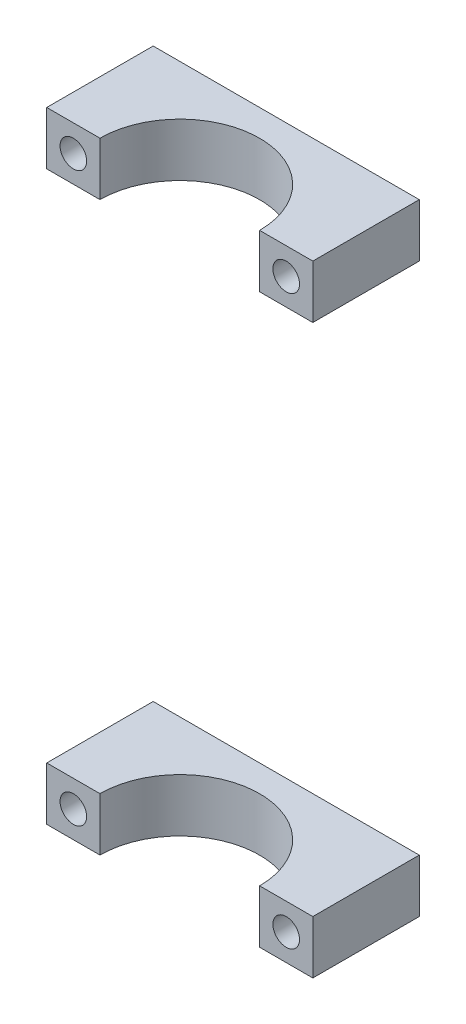
ISO-10303-21;
HEADER;
FILE_DESCRIPTION(('STEP AP214'),'2;1');
FILE_NAME('part.step','',(''),(''),'','','');
FILE_SCHEMA(('AUTOMOTIVE_DESIGN { 1 0 10303 214 1 1 1 1 }'));
ENDSEC;
DATA;
#1=APPLICATION_CONTEXT('core data for automotive mechanical design processes');
#2=APPLICATION_PROTOCOL_DEFINITION('international standard','automotive_design',2000,#1);
#3=PRODUCT_CONTEXT('',#1,'mechanical');
#4=PRODUCT('Part','Part','',(#3));
#5=PRODUCT_RELATED_PRODUCT_CATEGORY('part','',(#4));
#6=PRODUCT_DEFINITION_FORMATION('','',#4);
#7=PRODUCT_DEFINITION_CONTEXT('part definition',#1,'design');
#8=PRODUCT_DEFINITION('design','',#6,#7);
#9=PRODUCT_DEFINITION_SHAPE('','',#8);
#10=(LENGTH_UNIT() NAMED_UNIT(*) SI_UNIT(.MILLI.,.METRE.));
#11=(NAMED_UNIT(*) PLANE_ANGLE_UNIT() SI_UNIT($,.RADIAN.));
#12=(NAMED_UNIT(*) SI_UNIT($,.STERADIAN.) SOLID_ANGLE_UNIT());
#13=UNCERTAINTY_MEASURE_WITH_UNIT(LENGTH_MEASURE(1.E-05),#10,'distance_accuracy_value','');
#14=(GEOMETRIC_REPRESENTATION_CONTEXT(3) GLOBAL_UNCERTAINTY_ASSIGNED_CONTEXT((#13)) GLOBAL_UNIT_ASSIGNED_CONTEXT((#10,
#11,#12)) REPRESENTATION_CONTEXT('',''));
#15=CARTESIAN_POINT('',(0.,0.,0.));
#16=DIRECTION('',(0.,0.,1.));
#17=DIRECTION('',(1.,0.,0.));
#18=AXIS2_PLACEMENT_3D('',#15,#16,#17);
#19=CARTESIAN_POINT('',(40.,79.,-24.));
#20=DIRECTION('',(-1.,0.,0.));
#21=DIRECTION('',(0.,0.,1.));
#22=AXIS2_PLACEMENT_3D('',#19,#20,#21);
#23=PLANE('',#22);
#24=DIRECTION('',(0.,0.,1.));
#25=VECTOR('',#24,1.);
#26=CARTESIAN_POINT('',(40.,85.,-24.));
#27=LINE('',#26,#25);
#28=CARTESIAN_POINT('',(40.,85.,-24.));
#29=VERTEX_POINT('',#28);
#30=CARTESIAN_POINT('',(40.,85.,-12.));
#31=VERTEX_POINT('',#30);
#32=EDGE_CURVE('E125',#29,#31,#27,.T.);
#33=ORIENTED_EDGE('',*,*,#32,.T.);
#34=DIRECTION('',(0.,-1.,0.));
#35=VECTOR('',#34,1.);
#36=CARTESIAN_POINT('',(40.,79.,-12.));
#37=LINE('',#36,#35);
#38=CARTESIAN_POINT('',(40.,79.,-12.));
#39=VERTEX_POINT('',#38);
#40=EDGE_CURVE('E59',#31,#39,#37,.T.);
#41=ORIENTED_EDGE('',*,*,#40,.T.);
#42=DIRECTION('',(0.,0.,1.));
#43=VECTOR('',#42,1.);
#44=CARTESIAN_POINT('',(40.,79.,-24.));
#45=LINE('',#44,#43);
#46=CARTESIAN_POINT('',(40.,79.,-24.));
#47=VERTEX_POINT('',#46);
#48=EDGE_CURVE('E106',#47,#39,#45,.T.);
#49=ORIENTED_EDGE('',*,*,#48,.F.);
#50=DIRECTION('',(0.,-1.,0.));
#51=VECTOR('',#50,1.);
#52=CARTESIAN_POINT('',(40.,79.,-24.));
#53=LINE('',#52,#51);
#54=EDGE_CURVE('E112',#29,#47,#53,.T.);
#55=ORIENTED_EDGE('',*,*,#54,.F.);
#56=EDGE_LOOP('',(#33,#41,#49,#55));
#57=FACE_BOUND('',#56,.T.);
#58=ADVANCED_FACE('F42',(#57),#23,.F.);
#59=CARTESIAN_POINT('',(40.,79.,-24.));
#60=DIRECTION('',(0.,1.,0.));
#61=DIRECTION('',(-1.,0.,0.));
#62=AXIS2_PLACEMENT_3D('',#59,#60,#61);
#63=PLANE('',#62);
#64=ORIENTED_EDGE('',*,*,#48,.T.);
#65=DIRECTION('',(-1.,0.,0.));
#66=VECTOR('',#65,1.);
#67=CARTESIAN_POINT('',(40.,79.,-12.));
#68=LINE('',#67,#66);
#69=CARTESIAN_POINT('',(34.,79.,-12.));
#70=VERTEX_POINT('',#69);
#71=EDGE_CURVE('E120',#39,#70,#68,.T.);
#72=ORIENTED_EDGE('',*,*,#71,.T.);
#73=CARTESIAN_POINT('',(25.,79.,-12.));
#74=DIRECTION('',(0.,1.,0.));
#75=DIRECTION('',(-1.,0.,0.));
#76=AXIS2_PLACEMENT_3D('',#73,#74,#75);
#77=CIRCLE('',#76,9.);
#78=CARTESIAN_POINT('',(16.,79.,-12.));
#79=VERTEX_POINT('',#78);
#80=EDGE_CURVE('E122',#70,#79,#77,.T.);
#81=ORIENTED_EDGE('',*,*,#80,.T.);
#82=CARTESIAN_POINT('',(10.,79.,-12.));
#83=VERTEX_POINT('',#82);
#84=EDGE_CURVE('E124',#79,#83,#68,.T.);
#85=ORIENTED_EDGE('',*,*,#84,.T.);
#86=DIRECTION('',(0.,0.,1.));
#87=VECTOR('',#86,1.);
#88=CARTESIAN_POINT('',(10.,79.,-24.));
#89=LINE('',#88,#87);
#90=CARTESIAN_POINT('',(10.,79.,-24.));
#91=VERTEX_POINT('',#90);
#92=EDGE_CURVE('E109',#91,#83,#89,.T.);
#93=ORIENTED_EDGE('',*,*,#92,.F.);
#94=DIRECTION('',(-1.,0.,0.));
#95=VECTOR('',#94,1.);
#96=CARTESIAN_POINT('',(40.,79.,-24.));
#97=LINE('',#96,#95);
#98=EDGE_CURVE('E102',#47,#91,#97,.T.);
#99=ORIENTED_EDGE('',*,*,#98,.F.);
#100=EDGE_LOOP('',(#64,#72,#81,#85,#93,#99));
#101=FACE_BOUND('',#100,.T.);
#102=ADVANCED_FACE('F103',(#101),#63,.F.);
#103=CARTESIAN_POINT('',(10.,79.,-24.));
#104=DIRECTION('',(1.,0.,0.));
#105=DIRECTION('',(0.,0.,-1.));
#106=AXIS2_PLACEMENT_3D('',#103,#104,#105);
#107=PLANE('',#106);
#108=ORIENTED_EDGE('',*,*,#92,.T.);
#109=DIRECTION('',(0.,1.,0.));
#110=VECTOR('',#109,1.);
#111=CARTESIAN_POINT('',(10.,79.,-12.));
#112=LINE('',#111,#110);
#113=CARTESIAN_POINT('',(10.,85.,-12.));
#114=VERTEX_POINT('',#113);
#115=EDGE_CURVE('E132',#83,#114,#112,.T.);
#116=ORIENTED_EDGE('',*,*,#115,.T.);
#117=DIRECTION('',(0.,0.,1.));
#118=VECTOR('',#117,1.);
#119=CARTESIAN_POINT('',(10.,85.,-24.));
#120=LINE('',#119,#118);
#121=CARTESIAN_POINT('',(10.,85.,-24.));
#122=VERTEX_POINT('',#121);
#123=EDGE_CURVE('E133',#122,#114,#120,.T.);
#124=ORIENTED_EDGE('',*,*,#123,.F.);
#125=DIRECTION('',(0.,1.,0.));
#126=VECTOR('',#125,1.);
#127=CARTESIAN_POINT('',(10.,79.,-24.));
#128=LINE('',#127,#126);
#129=EDGE_CURVE('E111',#91,#122,#128,.T.);
#130=ORIENTED_EDGE('',*,*,#129,.F.);
#131=EDGE_LOOP('',(#108,#116,#124,#130));
#132=FACE_BOUND('',#131,.T.);
#133=ADVANCED_FACE('F165',(#132),#107,.F.);
#134=CARTESIAN_POINT('',(40.,85.,-24.));
#135=DIRECTION('',(0.,-1.,0.));
#136=DIRECTION('',(1.,0.,0.));
#137=AXIS2_PLACEMENT_3D('',#134,#135,#136);
#138=PLANE('',#137);
#139=ORIENTED_EDGE('',*,*,#123,.T.);
#140=DIRECTION('',(1.,0.,0.));
#141=VECTOR('',#140,1.);
#142=CARTESIAN_POINT('',(40.,85.,-12.));
#143=LINE('',#142,#141);
#144=CARTESIAN_POINT('',(16.,85.,-12.));
#145=VERTEX_POINT('',#144);
#146=EDGE_CURVE('E76',#114,#145,#143,.T.);
#147=ORIENTED_EDGE('',*,*,#146,.T.);
#148=CARTESIAN_POINT('',(25.,85.,-12.));
#149=DIRECTION('',(0.,-1.,0.));
#150=DIRECTION('',(1.,0.,0.));
#151=AXIS2_PLACEMENT_3D('',#148,#149,#150);
#152=CIRCLE('',#151,9.);
#153=CARTESIAN_POINT('',(34.,85.,-12.));
#154=VERTEX_POINT('',#153);
#155=EDGE_CURVE('E129',#145,#154,#152,.T.);
#156=ORIENTED_EDGE('',*,*,#155,.T.);
#157=EDGE_CURVE('E146',#154,#31,#143,.T.);
#158=ORIENTED_EDGE('',*,*,#157,.T.);
#159=ORIENTED_EDGE('',*,*,#32,.F.);
#160=DIRECTION('',(1.,0.,0.));
#161=VECTOR('',#160,1.);
#162=CARTESIAN_POINT('',(40.,85.,-24.));
#163=LINE('',#162,#161);
#164=EDGE_CURVE('E89',#122,#29,#163,.T.);
#165=ORIENTED_EDGE('',*,*,#164,.F.);
#166=EDGE_LOOP('',(#139,#147,#156,#158,#159,#165));
#167=FACE_BOUND('',#166,.T.);
#168=ADVANCED_FACE('F162',(#167),#138,.F.);
#169=CARTESIAN_POINT('',(0.,0.,-24.));
#170=DIRECTION('',(0.,0.,1.));
#171=DIRECTION('',(1.,0.,0.));
#172=AXIS2_PLACEMENT_3D('',#169,#170,#171);
#173=PLANE('',#172);
#174=CARTESIAN_POINT('',(13.,82.,-24.));
#175=DIRECTION('',(0.,0.,1.));
#176=DIRECTION('',(1.,0.,0.));
#177=AXIS2_PLACEMENT_3D('',#174,#175,#176);
#178=CIRCLE('',#177,1.5);
#179=CARTESIAN_POINT('',(14.5,82.,-24.));
#180=VERTEX_POINT('',#179);
#181=EDGE_CURVE('E157',#180,#180,#178,.T.);
#182=ORIENTED_EDGE('',*,*,#181,.T.);
#183=EDGE_LOOP('',(#182));
#184=FACE_BOUND('',#183,.T.);
#185=CARTESIAN_POINT('',(37.,82.,-24.));
#186=DIRECTION('',(0.,0.,1.));
#187=DIRECTION('',(1.,0.,0.));
#188=AXIS2_PLACEMENT_3D('',#185,#186,#187);
#189=CIRCLE('',#188,1.5);
#190=CARTESIAN_POINT('',(38.5,82.,-24.));
#191=VERTEX_POINT('',#190);
#192=EDGE_CURVE('E118',#191,#191,#189,.T.);
#193=ORIENTED_EDGE('',*,*,#192,.T.);
#194=EDGE_LOOP('',(#193));
#195=FACE_BOUND('',#194,.T.);
#196=ORIENTED_EDGE('',*,*,#54,.T.);
#197=ORIENTED_EDGE('',*,*,#98,.T.);
#198=ORIENTED_EDGE('',*,*,#129,.T.);
#199=ORIENTED_EDGE('',*,*,#164,.T.);
#200=EDGE_LOOP('',(#196,#197,#198,#199));
#201=FACE_BOUND('',#200,.T.);
#202=ADVANCED_FACE('F115',(#184,#195,#201),#173,.F.);
#203=CARTESIAN_POINT('',(25.,100.,-12.));
#204=DIRECTION('',(0.,-1.,0.));
#205=DIRECTION('',(1.,0.,0.));
#206=AXIS2_PLACEMENT_3D('',#203,#204,#205);
#207=CYLINDRICAL_SURFACE('',#206,9.);
#208=ORIENTED_EDGE('',*,*,#80,.F.);
#209=DIRECTION('',(0.,-1.,0.));
#210=VECTOR('',#209,1.);
#211=CARTESIAN_POINT('',(34.,100.,-12.));
#212=LINE('',#211,#210);
#213=EDGE_CURVE('E138',#70,#154,#212,.F.);
#214=ORIENTED_EDGE('',*,*,#213,.T.);
#215=ORIENTED_EDGE('',*,*,#155,.F.);
#216=DIRECTION('',(0.,-1.,0.));
#217=VECTOR('',#216,1.);
#218=CARTESIAN_POINT('',(16.,100.,-12.));
#219=LINE('',#218,#217);
#220=EDGE_CURVE('E81',#145,#79,#219,.T.);
#221=ORIENTED_EDGE('',*,*,#220,.T.);
#222=EDGE_LOOP('',(#208,#214,#215,#221));
#223=FACE_BOUND('',#222,.T.);
#224=ADVANCED_FACE('F161',(#223),#207,.F.);
#225=CARTESIAN_POINT('',(37.,82.,30.));
#226=DIRECTION('',(0.,0.,-1.));
#227=DIRECTION('',(-1.,0.,0.));
#228=AXIS2_PLACEMENT_3D('',#225,#226,#227);
#229=CYLINDRICAL_SURFACE('',#228,1.5);
#230=CARTESIAN_POINT('',(37.,82.,-12.));
#231=DIRECTION('',(0.,0.,-1.));
#232=DIRECTION('',(-1.,0.,0.));
#233=AXIS2_PLACEMENT_3D('',#230,#231,#232);
#234=CIRCLE('',#233,1.5);
#235=CARTESIAN_POINT('',(35.5,82.,-12.));
#236=VERTEX_POINT('',#235);
#237=EDGE_CURVE('E51',#236,#236,#234,.F.);
#238=ORIENTED_EDGE('',*,*,#237,.T.);
#239=EDGE_LOOP('',(#238));
#240=FACE_BOUND('',#239,.T.);
#241=ORIENTED_EDGE('',*,*,#192,.F.);
#242=EDGE_LOOP('',(#241));
#243=FACE_BOUND('',#242,.T.);
#244=ADVANCED_FACE('F150',(#240,#243),#229,.F.);
#245=CARTESIAN_POINT('',(13.,82.,30.));
#246=DIRECTION('',(0.,0.,-1.));
#247=DIRECTION('',(-1.,0.,0.));
#248=AXIS2_PLACEMENT_3D('',#245,#246,#247);
#249=CYLINDRICAL_SURFACE('',#248,1.5);
#250=CARTESIAN_POINT('',(13.,82.,-12.));
#251=DIRECTION('',(0.,0.,-1.));
#252=DIRECTION('',(-1.,0.,0.));
#253=AXIS2_PLACEMENT_3D('',#250,#251,#252);
#254=CIRCLE('',#253,1.5);
#255=CARTESIAN_POINT('',(11.5,82.,-12.));
#256=VERTEX_POINT('',#255);
#257=EDGE_CURVE('E12',#256,#256,#254,.F.);
#258=ORIENTED_EDGE('',*,*,#257,.T.);
#259=EDGE_LOOP('',(#258));
#260=FACE_BOUND('',#259,.T.);
#261=ORIENTED_EDGE('',*,*,#181,.F.);
#262=EDGE_LOOP('',(#261));
#263=FACE_BOUND('',#262,.T.);
#264=ADVANCED_FACE('F167',(#260,#263),#249,.F.);
#265=CARTESIAN_POINT('',(0.,100.,-12.));
#266=DIRECTION('',(0.,0.,-1.));
#267=DIRECTION('',(-1.,0.,0.));
#268=AXIS2_PLACEMENT_3D('',#265,#266,#267);
#269=PLANE('',#268);
#270=ORIENTED_EDGE('',*,*,#257,.F.);
#271=EDGE_LOOP('',(#270));
#272=FACE_BOUND('',#271,.T.);
#273=ORIENTED_EDGE('',*,*,#220,.F.);
#274=ORIENTED_EDGE('',*,*,#146,.F.);
#275=ORIENTED_EDGE('',*,*,#115,.F.);
#276=ORIENTED_EDGE('',*,*,#84,.F.);
#277=EDGE_LOOP('',(#273,#274,#275,#276));
#278=FACE_BOUND('',#277,.T.);
#279=ADVANCED_FACE('F154',(#272,#278),#269,.F.);
#280=ORIENTED_EDGE('',*,*,#237,.F.);
#281=EDGE_LOOP('',(#280));
#282=FACE_BOUND('',#281,.T.);
#283=ORIENTED_EDGE('',*,*,#157,.F.);
#284=ORIENTED_EDGE('',*,*,#213,.F.);
#285=ORIENTED_EDGE('',*,*,#71,.F.);
#286=ORIENTED_EDGE('',*,*,#40,.F.);
#287=EDGE_LOOP('',(#283,#284,#285,#286));
#288=FACE_BOUND('',#287,.T.);
#289=ADVANCED_FACE('F44',(#282,#288),#269,.F.);
#290=CLOSED_SHELL('',(#58,#102,#133,#168,#202,#224,#244,#264,#279,#289));
#291=MANIFOLD_SOLID_BREP('B2',#290);
#292=CARTESIAN_POINT('',(25.,100.,-12.));
#293=DIRECTION('',(0.,-1.,0.));
#294=DIRECTION('',(1.,0.,0.));
#295=AXIS2_PLACEMENT_3D('',#292,#293,#294);
#296=CYLINDRICAL_SURFACE('',#295,9.);
#297=CARTESIAN_POINT('',(25.,15.,-12.));
#298=DIRECTION('',(0.,1.,0.));
#299=DIRECTION('',(-1.,0.,0.));
#300=AXIS2_PLACEMENT_3D('',#297,#298,#299);
#301=CIRCLE('',#300,9.);
#302=CARTESIAN_POINT('',(34.,15.,-12.));
#303=VERTEX_POINT('',#302);
#304=CARTESIAN_POINT('',(16.,15.,-12.));
#305=VERTEX_POINT('',#304);
#306=EDGE_CURVE('E331',#303,#305,#301,.T.);
#307=ORIENTED_EDGE('',*,*,#306,.F.);
#308=DIRECTION('',(0.,-1.,0.));
#309=VECTOR('',#308,1.);
#310=CARTESIAN_POINT('',(34.,100.,-12.));
#311=LINE('',#310,#309);
#312=CARTESIAN_POINT('',(34.,21.,-12.));
#313=VERTEX_POINT('',#312);
#314=EDGE_CURVE('E330',#303,#313,#311,.F.);
#315=ORIENTED_EDGE('',*,*,#314,.T.);
#316=CARTESIAN_POINT('',(25.,21.,-12.));
#317=DIRECTION('',(0.,-1.,0.));
#318=DIRECTION('',(1.,0.,0.));
#319=AXIS2_PLACEMENT_3D('',#316,#317,#318);
#320=CIRCLE('',#319,9.);
#321=CARTESIAN_POINT('',(16.,21.,-12.));
#322=VERTEX_POINT('',#321);
#323=EDGE_CURVE('E324',#322,#313,#320,.T.);
#324=ORIENTED_EDGE('',*,*,#323,.F.);
#325=DIRECTION('',(0.,-1.,0.));
#326=VECTOR('',#325,1.);
#327=CARTESIAN_POINT('',(16.,100.,-12.));
#328=LINE('',#327,#326);
#329=EDGE_CURVE('E309',#322,#305,#328,.T.);
#330=ORIENTED_EDGE('',*,*,#329,.T.);
#331=EDGE_LOOP('',(#307,#315,#324,#330));
#332=FACE_BOUND('',#331,.T.);
#333=ADVANCED_FACE('F257',(#332),#296,.F.);
#334=CARTESIAN_POINT('',(40.,21.,-24.));
#335=DIRECTION('',(0.,-1.,0.));
#336=DIRECTION('',(1.,0.,0.));
#337=AXIS2_PLACEMENT_3D('',#334,#335,#336);
#338=PLANE('',#337);
#339=DIRECTION('',(0.,0.,1.));
#340=VECTOR('',#339,1.);
#341=CARTESIAN_POINT('',(10.,21.,-24.));
#342=LINE('',#341,#340);
#343=CARTESIAN_POINT('',(10.,21.,-24.));
#344=VERTEX_POINT('',#343);
#345=CARTESIAN_POINT('',(10.,21.,-12.));
#346=VERTEX_POINT('',#345);
#347=EDGE_CURVE('E327',#344,#346,#342,.T.);
#348=ORIENTED_EDGE('',*,*,#347,.T.);
#349=DIRECTION('',(1.,0.,0.));
#350=VECTOR('',#349,1.);
#351=CARTESIAN_POINT('',(40.,21.,-12.));
#352=LINE('',#351,#350);
#353=EDGE_CURVE('E312',#346,#322,#352,.T.);
#354=ORIENTED_EDGE('',*,*,#353,.T.);
#355=ORIENTED_EDGE('',*,*,#323,.T.);
#356=CARTESIAN_POINT('',(40.,21.,-12.));
#357=VERTEX_POINT('',#356);
#358=EDGE_CURVE('E282',#313,#357,#352,.T.);
#359=ORIENTED_EDGE('',*,*,#358,.T.);
#360=DIRECTION('',(0.,0.,1.));
#361=VECTOR('',#360,1.);
#362=CARTESIAN_POINT('',(40.,21.,-24.));
#363=LINE('',#362,#361);
#364=CARTESIAN_POINT('',(40.,21.,-24.));
#365=VERTEX_POINT('',#364);
#366=EDGE_CURVE('E350',#365,#357,#363,.T.);
#367=ORIENTED_EDGE('',*,*,#366,.F.);
#368=DIRECTION('',(1.,0.,0.));
#369=VECTOR('',#368,1.);
#370=CARTESIAN_POINT('',(40.,21.,-24.));
#371=LINE('',#370,#369);
#372=EDGE_CURVE('E348',#344,#365,#371,.T.);
#373=ORIENTED_EDGE('',*,*,#372,.F.);
#374=EDGE_LOOP('',(#348,#354,#355,#359,#367,#373));
#375=FACE_BOUND('',#374,.T.);
#376=ADVANCED_FACE('F323',(#375),#338,.F.);
#377=CARTESIAN_POINT('',(10.,21.,-24.));
#378=DIRECTION('',(1.,0.,0.));
#379=DIRECTION('',(0.,0.,-1.));
#380=AXIS2_PLACEMENT_3D('',#377,#378,#379);
#381=PLANE('',#380);
#382=DIRECTION('',(0.,0.,1.));
#383=VECTOR('',#382,1.);
#384=CARTESIAN_POINT('',(10.,15.,-24.));
#385=LINE('',#384,#383);
#386=CARTESIAN_POINT('',(10.,15.,-24.));
#387=VERTEX_POINT('',#386);
#388=CARTESIAN_POINT('',(10.,15.,-12.));
#389=VERTEX_POINT('',#388);
#390=EDGE_CURVE('E266',#387,#389,#385,.T.);
#391=ORIENTED_EDGE('',*,*,#390,.T.);
#392=DIRECTION('',(0.,1.,0.));
#393=VECTOR('',#392,1.);
#394=CARTESIAN_POINT('',(10.,21.,-12.));
#395=LINE('',#394,#393);
#396=EDGE_CURVE('E328',#389,#346,#395,.T.);
#397=ORIENTED_EDGE('',*,*,#396,.T.);
#398=ORIENTED_EDGE('',*,*,#347,.F.);
#399=DIRECTION('',(0.,1.,0.));
#400=VECTOR('',#399,1.);
#401=CARTESIAN_POINT('',(10.,21.,-24.));
#402=LINE('',#401,#400);
#403=EDGE_CURVE('E346',#387,#344,#402,.T.);
#404=ORIENTED_EDGE('',*,*,#403,.F.);
#405=EDGE_LOOP('',(#391,#397,#398,#404));
#406=FACE_BOUND('',#405,.T.);
#407=ADVANCED_FACE('F395',(#406),#381,.F.);
#408=CARTESIAN_POINT('',(40.,15.,-24.));
#409=DIRECTION('',(0.,1.,0.));
#410=DIRECTION('',(-1.,0.,0.));
#411=AXIS2_PLACEMENT_3D('',#408,#409,#410);
#412=PLANE('',#411);
#413=DIRECTION('',(0.,0.,1.));
#414=VECTOR('',#413,1.);
#415=CARTESIAN_POINT('',(40.,15.,-24.));
#416=LINE('',#415,#414);
#417=CARTESIAN_POINT('',(40.,15.,-24.));
#418=VERTEX_POINT('',#417);
#419=CARTESIAN_POINT('',(40.,15.,-12.));
#420=VERTEX_POINT('',#419);
#421=EDGE_CURVE('E40',#418,#420,#416,.T.);
#422=ORIENTED_EDGE('',*,*,#421,.T.);
#423=DIRECTION('',(-1.,0.,0.));
#424=VECTOR('',#423,1.);
#425=CARTESIAN_POINT('',(40.,15.,-12.));
#426=LINE('',#425,#424);
#427=EDGE_CURVE('E360',#420,#303,#426,.T.);
#428=ORIENTED_EDGE('',*,*,#427,.T.);
#429=ORIENTED_EDGE('',*,*,#306,.T.);
#430=EDGE_CURVE('E274',#305,#389,#426,.T.);
#431=ORIENTED_EDGE('',*,*,#430,.T.);
#432=ORIENTED_EDGE('',*,*,#390,.F.);
#433=DIRECTION('',(-1.,0.,0.));
#434=VECTOR('',#433,1.);
#435=CARTESIAN_POINT('',(40.,15.,-24.));
#436=LINE('',#435,#434);
#437=EDGE_CURVE('E344',#418,#387,#436,.T.);
#438=ORIENTED_EDGE('',*,*,#437,.F.);
#439=EDGE_LOOP('',(#422,#428,#429,#431,#432,#438));
#440=FACE_BOUND('',#439,.T.);
#441=ADVANCED_FACE('F403',(#440),#412,.F.);
#442=CARTESIAN_POINT('',(40.,21.,-24.));
#443=DIRECTION('',(-1.,0.,0.));
#444=DIRECTION('',(0.,0.,1.));
#445=AXIS2_PLACEMENT_3D('',#442,#443,#444);
#446=PLANE('',#445);
#447=ORIENTED_EDGE('',*,*,#366,.T.);
#448=DIRECTION('',(0.,-1.,0.));
#449=VECTOR('',#448,1.);
#450=CARTESIAN_POINT('',(40.,21.,-12.));
#451=LINE('',#450,#449);
#452=EDGE_CURVE('E339',#357,#420,#451,.T.);
#453=ORIENTED_EDGE('',*,*,#452,.T.);
#454=ORIENTED_EDGE('',*,*,#421,.F.);
#455=DIRECTION('',(0.,-1.,0.));
#456=VECTOR('',#455,1.);
#457=CARTESIAN_POINT('',(40.,21.,-24.));
#458=LINE('',#457,#456);
#459=EDGE_CURVE('E334',#365,#418,#458,.T.);
#460=ORIENTED_EDGE('',*,*,#459,.F.);
#461=EDGE_LOOP('',(#447,#453,#454,#460));
#462=FACE_BOUND('',#461,.T.);
#463=ADVANCED_FACE('F259',(#462),#446,.F.);
#464=CARTESIAN_POINT('',(13.,18.,30.));
#465=DIRECTION('',(0.,0.,-1.));
#466=DIRECTION('',(-1.,0.,0.));
#467=AXIS2_PLACEMENT_3D('',#464,#465,#466);
#468=CYLINDRICAL_SURFACE('',#467,1.5);
#469=CARTESIAN_POINT('',(13.,18.,-12.));
#470=DIRECTION('',(0.,0.,-1.));
#471=DIRECTION('',(-1.,0.,0.));
#472=AXIS2_PLACEMENT_3D('',#469,#470,#471);
#473=CIRCLE('',#472,1.5);
#474=CARTESIAN_POINT('',(11.5,18.,-12.));
#475=VERTEX_POINT('',#474);
#476=EDGE_CURVE('E318',#475,#475,#473,.F.);
#477=ORIENTED_EDGE('',*,*,#476,.T.);
#478=EDGE_LOOP('',(#477));
#479=FACE_BOUND('',#478,.T.);
#480=CARTESIAN_POINT('',(13.,18.,-24.));
#481=DIRECTION('',(0.,0.,-1.));
#482=DIRECTION('',(-1.,0.,0.));
#483=AXIS2_PLACEMENT_3D('',#480,#481,#482);
#484=CIRCLE('',#483,1.5);
#485=CARTESIAN_POINT('',(11.5,18.,-24.));
#486=VERTEX_POINT('',#485);
#487=EDGE_CURVE('E337',#486,#486,#484,.T.);
#488=ORIENTED_EDGE('',*,*,#487,.T.);
#489=EDGE_LOOP('',(#488));
#490=FACE_BOUND('',#489,.T.);
#491=ADVANCED_FACE('F399',(#479,#490),#468,.F.);
#492=CARTESIAN_POINT('',(0.,0.,-24.));
#493=DIRECTION('',(0.,0.,-1.));
#494=DIRECTION('',(-1.,0.,0.));
#495=AXIS2_PLACEMENT_3D('',#492,#493,#494);
#496=PLANE('',#495);
#497=CARTESIAN_POINT('',(37.,18.,-24.));
#498=DIRECTION('',(0.,0.,-1.));
#499=DIRECTION('',(-1.,0.,0.));
#500=AXIS2_PLACEMENT_3D('',#497,#498,#499);
#501=CIRCLE('',#500,1.5);
#502=CARTESIAN_POINT('',(35.5,18.,-24.));
#503=VERTEX_POINT('',#502);
#504=EDGE_CURVE('E332',#503,#503,#501,.T.);
#505=ORIENTED_EDGE('',*,*,#504,.F.);
#506=EDGE_LOOP('',(#505));
#507=FACE_BOUND('',#506,.T.);
#508=ORIENTED_EDGE('',*,*,#487,.F.);
#509=EDGE_LOOP('',(#508));
#510=FACE_BOUND('',#509,.T.);
#511=ORIENTED_EDGE('',*,*,#459,.T.);
#512=ORIENTED_EDGE('',*,*,#437,.T.);
#513=ORIENTED_EDGE('',*,*,#403,.T.);
#514=ORIENTED_EDGE('',*,*,#372,.T.);
#515=EDGE_LOOP('',(#511,#512,#513,#514));
#516=FACE_BOUND('',#515,.T.);
#517=ADVANCED_FACE('F387',(#507,#510,#516),#496,.T.);
#518=CARTESIAN_POINT('',(37.,18.,30.));
#519=DIRECTION('',(0.,0.,-1.));
#520=DIRECTION('',(-1.,0.,0.));
#521=AXIS2_PLACEMENT_3D('',#518,#519,#520);
#522=CYLINDRICAL_SURFACE('',#521,1.5);
#523=CARTESIAN_POINT('',(37.,18.,-12.));
#524=DIRECTION('',(0.,0.,-1.));
#525=DIRECTION('',(-1.,0.,0.));
#526=AXIS2_PLACEMENT_3D('',#523,#524,#525);
#527=CIRCLE('',#526,1.5);
#528=CARTESIAN_POINT('',(35.5,18.,-12.));
#529=VERTEX_POINT('',#528);
#530=EDGE_CURVE('E261',#529,#529,#527,.F.);
#531=ORIENTED_EDGE('',*,*,#530,.T.);
#532=EDGE_LOOP('',(#531));
#533=FACE_BOUND('',#532,.T.);
#534=ORIENTED_EDGE('',*,*,#504,.T.);
#535=EDGE_LOOP('',(#534));
#536=FACE_BOUND('',#535,.T.);
#537=ADVANCED_FACE('F376',(#533,#536),#522,.F.);
#538=CARTESIAN_POINT('',(0.,100.,-12.));
#539=DIRECTION('',(0.,0.,-1.));
#540=DIRECTION('',(-1.,0.,0.));
#541=AXIS2_PLACEMENT_3D('',#538,#539,#540);
#542=PLANE('',#541);
#543=ORIENTED_EDGE('',*,*,#530,.F.);
#544=EDGE_LOOP('',(#543));
#545=FACE_BOUND('',#544,.T.);
#546=ORIENTED_EDGE('',*,*,#358,.F.);
#547=ORIENTED_EDGE('',*,*,#314,.F.);
#548=ORIENTED_EDGE('',*,*,#427,.F.);
#549=ORIENTED_EDGE('',*,*,#452,.F.);
#550=EDGE_LOOP('',(#546,#547,#548,#549));
#551=FACE_BOUND('',#550,.T.);
#552=ADVANCED_FACE('F379',(#545,#551),#542,.F.);
#553=ORIENTED_EDGE('',*,*,#476,.F.);
#554=EDGE_LOOP('',(#553));
#555=FACE_BOUND('',#554,.T.);
#556=ORIENTED_EDGE('',*,*,#329,.F.);
#557=ORIENTED_EDGE('',*,*,#353,.F.);
#558=ORIENTED_EDGE('',*,*,#396,.F.);
#559=ORIENTED_EDGE('',*,*,#430,.F.);
#560=EDGE_LOOP('',(#556,#557,#558,#559));
#561=FACE_BOUND('',#560,.T.);
#562=ADVANCED_FACE('F311',(#555,#561),#542,.F.);
#563=CLOSED_SHELL('',(#333,#376,#407,#441,#463,#491,#517,#537,#552,#562));
#564=MANIFOLD_SOLID_BREP('B6',#563);
#565=ADVANCED_BREP_SHAPE_REPRESENTATION('',(#18,#291,#564),#14);
#566=SHAPE_DEFINITION_REPRESENTATION(#9,#565);
ENDSEC;
END-ISO-10303-21;
